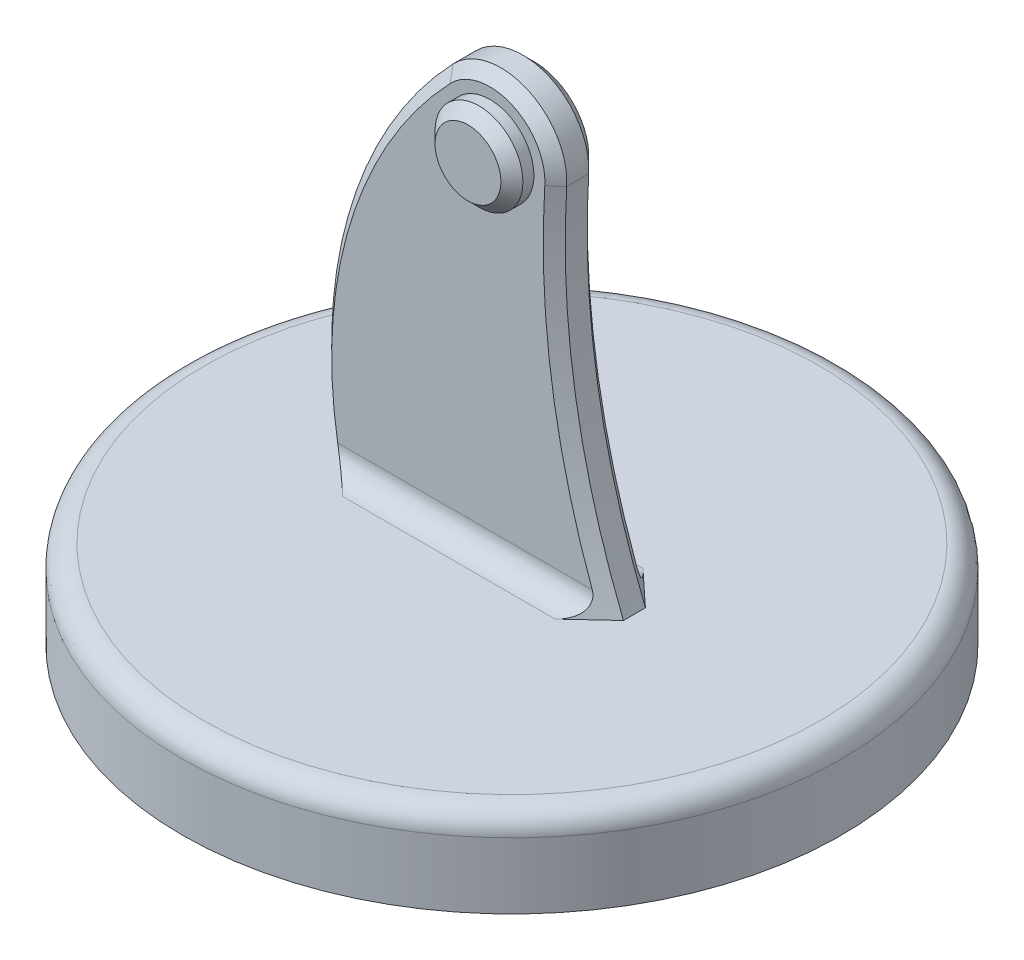
ISO-10303-21;
HEADER;
FILE_DESCRIPTION(('STEP AP214'),'2;1');
FILE_NAME('part.step','',(''),(''),'','','');
FILE_SCHEMA(('AUTOMOTIVE_DESIGN { 1 0 10303 214 1 1 1 1 }'));
ENDSEC;
DATA;
#1=APPLICATION_CONTEXT('core data for automotive mechanical design processes');
#2=APPLICATION_PROTOCOL_DEFINITION('international standard','automotive_design',2000,#1);
#3=PRODUCT_CONTEXT('',#1,'mechanical');
#4=PRODUCT('Part','Part','',(#3));
#5=PRODUCT_RELATED_PRODUCT_CATEGORY('part','',(#4));
#6=PRODUCT_DEFINITION_FORMATION('','',#4);
#7=PRODUCT_DEFINITION_CONTEXT('part definition',#1,'design');
#8=PRODUCT_DEFINITION('design','',#6,#7);
#9=PRODUCT_DEFINITION_SHAPE('','',#8);
#10=(LENGTH_UNIT() NAMED_UNIT(*) SI_UNIT(.MILLI.,.METRE.));
#11=(NAMED_UNIT(*) PLANE_ANGLE_UNIT() SI_UNIT($,.RADIAN.));
#12=(NAMED_UNIT(*) SI_UNIT($,.STERADIAN.) SOLID_ANGLE_UNIT());
#13=UNCERTAINTY_MEASURE_WITH_UNIT(LENGTH_MEASURE(1.E-05),#10,'distance_accuracy_value','');
#14=(GEOMETRIC_REPRESENTATION_CONTEXT(3) GLOBAL_UNCERTAINTY_ASSIGNED_CONTEXT((#13)) GLOBAL_UNIT_ASSIGNED_CONTEXT((#10,
#11,#12)) REPRESENTATION_CONTEXT('',''));
#15=CARTESIAN_POINT('',(0.,0.,0.));
#16=DIRECTION('',(0.,0.,1.));
#17=DIRECTION('',(1.,0.,0.));
#18=AXIS2_PLACEMENT_3D('',#15,#16,#17);
#19=CARTESIAN_POINT('',(0.,20.,0.));
#20=DIRECTION('',(0.,1.,0.));
#21=DIRECTION('',(0.,0.,1.));
#22=AXIS2_PLACEMENT_3D('',#19,#20,#21);
#23=PLANE('',#22);
#24=CARTESIAN_POINT('',(0.,20.,0.));
#25=DIRECTION('',(0.,1.,0.));
#26=DIRECTION('',(0.,0.,1.));
#27=AXIS2_PLACEMENT_3D('',#24,#25,#26);
#28=CIRCLE('',#27,70.);
#29=CARTESIAN_POINT('',(0.,20.,70.));
#30=VERTEX_POINT('',#29);
#31=EDGE_CURVE('E311',#30,#30,#28,.T.);
#32=ORIENTED_EDGE('',*,*,#31,.T.);
#33=EDGE_LOOP('',(#32));
#34=FACE_BOUND('',#33,.T.);
#35=CARTESIAN_POINT('',(-36.2257918410724,20.,-2.50000000000002));
#36=CARTESIAN_POINT('',(-35.372613344394,20.,-3.33359235450623));
#37=CARTESIAN_POINT('',(-34.5191891841924,20.,-4.16693335697092));
#38=CARTESIAN_POINT('',(-32.810937278002,20.,-5.83391380233446));
#39=CARTESIAN_POINT('',(-31.9561089872259,20.,-6.66755268694827));
#40=CARTESIAN_POINT('',(-30.2458713230933,20.,-8.3342347389184));
#41=CARTESIAN_POINT('',(-29.3904619495461,20.,-9.16727790607913));
#42=CARTESIAN_POINT('',(-28.5347400447996,20.,-9.99999999999031));
#43=B_SPLINE_CURVE_WITH_KNOTS('',3,(#35,#36,#37,#38,#39,#40,#41,#42),.UNSPECIFIED.,.F.,.F.,(4,2,
2,4),(0.,3.57842257820069,7.1604841137538,10.7425468249048),.UNSPECIFIED.);
#44=CARTESIAN_POINT('',(-36.2257918410724,20.,-2.50000000000002));
#45=VERTEX_POINT('',#44);
#46=CARTESIAN_POINT('',(-28.5347400447996,20.,-10.));
#47=VERTEX_POINT('',#46);
#48=EDGE_CURVE('E166',#45,#47,#43,.T.);
#49=ORIENTED_EDGE('',*,*,#48,.T.);
#50=DIRECTION('',(-1.,0.,0.));
#51=VECTOR('',#50,1.);
#52=CARTESIAN_POINT('',(25.1824752050036,20.,-10.));
#53=LINE('',#52,#51);
#54=CARTESIAN_POINT('',(19.8084097202043,20.,-10.));
#55=VERTEX_POINT('',#54);
#56=EDGE_CURVE('E271',#47,#55,#53,.F.);
#57=ORIENTED_EDGE('',*,*,#56,.T.);
#58=CARTESIAN_POINT('',(19.8084097202043,20.,-10.0000000000142));
#59=CARTESIAN_POINT('',(20.7032286114567,20.,-9.16574365324218));
#60=CARTESIAN_POINT('',(21.5984643871095,20.,-8.33193432975183));
#61=CARTESIAN_POINT('',(23.3898068938393,20.,-6.66525336177311));
#62=CARTESIAN_POINT('',(24.2859136241568,20.,-5.83238171646846));
#63=CARTESIAN_POINT('',(26.0805990637617,20.,-4.16616784041951));
#64=CARTESIAN_POINT('',(26.979179359604,20.,-3.33282731858596));
#65=CARTESIAN_POINT('',(27.8782351753599,20.,-2.50000000000002));
#66=B_SPLINE_CURVE_WITH_KNOTS('',3,(#58,#59,#60,#61,#62,#63,#64,#65),.UNSPECIFIED.,.F.,.F.,(4,2,
2,4),(0.,3.67017170975709,7.34034022203765,11.0169040821896),.UNSPECIFIED.);
#67=CARTESIAN_POINT('',(27.8782351753599,20.,-2.50000000000002));
#68=VERTEX_POINT('',#67);
#69=EDGE_CURVE('E174',#55,#68,#66,.T.);
#70=ORIENTED_EDGE('',*,*,#69,.T.);
#71=DIRECTION('',(0.,0.,-1.));
#72=VECTOR('',#71,1.);
#73=CARTESIAN_POINT('',(27.8782351753599,20.,5.));
#74=LINE('',#73,#72);
#75=CARTESIAN_POINT('',(27.8782351753599,20.,2.50000000000002));
#76=VERTEX_POINT('',#75);
#77=EDGE_CURVE('E134',#68,#76,#74,.F.);
#78=ORIENTED_EDGE('',*,*,#77,.T.);
#79=CARTESIAN_POINT('',(27.8782351753599,20.,2.50000000000002));
#80=CARTESIAN_POINT('',(26.979179359604,20.,3.33282731858595));
#81=CARTESIAN_POINT('',(26.0805990637617,20.,4.1661678404195));
#82=CARTESIAN_POINT('',(24.2859136241593,20.,5.8323817164661));
#83=CARTESIAN_POINT('',(23.3898068938444,20.,6.66525336176839));
#84=CARTESIAN_POINT('',(21.5984643871197,20.,8.33193432974237));
#85=CARTESIAN_POINT('',(20.7032286114694,20.,9.16574365323034));
#86=CARTESIAN_POINT('',(19.8084097202195,20.,9.99999999999999));
#87=B_SPLINE_CURVE_WITH_KNOTS('',3,(#79,#80,#81,#82,#83,#84,#85,#86),.UNSPECIFIED.,.F.,.F.,(4,2,
2,4),(0.,3.67656386015198,7.34673237242213,11.0169040821688),.UNSPECIFIED.);
#88=CARTESIAN_POINT('',(19.8084097202195,20.,10.));
#89=VERTEX_POINT('',#88);
#90=EDGE_CURVE('E124',#76,#89,#87,.T.);
#91=ORIENTED_EDGE('',*,*,#90,.T.);
#92=DIRECTION('',(-1.,0.,0.));
#93=VECTOR('',#92,1.);
#94=CARTESIAN_POINT('',(0.,20.,10.));
#95=LINE('',#94,#93);
#96=CARTESIAN_POINT('',(-28.5347400447897,20.,10.));
#97=VERTEX_POINT('',#96);
#98=EDGE_CURVE('E121',#89,#97,#95,.T.);
#99=ORIENTED_EDGE('',*,*,#98,.T.);
#100=CARTESIAN_POINT('',(-28.5347400447897,20.,10.));
#101=CARTESIAN_POINT('',(-29.3904619495378,20.,9.16727790608721));
#102=CARTESIAN_POINT('',(-30.2458713230867,20.,8.33423473892487));
#103=CARTESIAN_POINT('',(-31.9561089872226,20.,6.66755268695151));
#104=CARTESIAN_POINT('',(-32.8109372780003,20.,5.83391380233608));
#105=CARTESIAN_POINT('',(-34.5191891841924,20.,4.16693335697092));
#106=CARTESIAN_POINT('',(-35.372613344394,20.,3.33359235450623));
#107=CARTESIAN_POINT('',(-36.2257918410724,20.,2.50000000000002));
#108=B_SPLINE_CURVE_WITH_KNOTS('',3,(#100,#101,#102,#103,#104,#105,#106,#107),.UNSPECIFIED.,.F.,
.F.,(4,2,2,4),(0.,3.58206271115799,7.16412424671804,10.7425468249187),.UNSPECIFIED.);
#109=CARTESIAN_POINT('',(-36.2257918410724,20.,2.50000000000002));
#110=VERTEX_POINT('',#109);
#111=EDGE_CURVE('E117',#97,#110,#108,.T.);
#112=ORIENTED_EDGE('',*,*,#111,.T.);
#113=DIRECTION('',(0.,0.,-1.));
#114=VECTOR('',#113,1.);
#115=CARTESIAN_POINT('',(-36.2257918410724,20.,5.));
#116=LINE('',#115,#114);
#117=EDGE_CURVE('E119',#110,#45,#116,.T.);
#118=ORIENTED_EDGE('',*,*,#117,.T.);
#119=EDGE_LOOP('',(#49,#57,#70,#78,#91,#99,#112,#118));
#120=FACE_BOUND('',#119,.T.);
#121=ADVANCED_FACE('F38',(#34,#120),#23,.T.);
#122=CARTESIAN_POINT('',(0.,20.,0.));
#123=DIRECTION('',(0.,-1.,0.));
#124=DIRECTION('',(0.,0.,-1.));
#125=AXIS2_PLACEMENT_3D('',#122,#123,#124);
#126=CYLINDRICAL_SURFACE('',#125,75.);
#127=CARTESIAN_POINT('',(0.,15.,0.));
#128=DIRECTION('',(0.,1.,0.));
#129=DIRECTION('',(0.,0.,1.));
#130=AXIS2_PLACEMENT_3D('',#127,#128,#129);
#131=CIRCLE('',#130,75.);
#132=CARTESIAN_POINT('',(0.,15.,75.));
#133=VERTEX_POINT('',#132);
#134=EDGE_CURVE('E318',#133,#133,#131,.F.);
#135=ORIENTED_EDGE('',*,*,#134,.T.);
#136=EDGE_LOOP('',(#135));
#137=FACE_BOUND('',#136,.T.);
#138=CARTESIAN_POINT('',(0.,0.,0.));
#139=DIRECTION('',(0.,1.,0.));
#140=DIRECTION('',(0.,0.,1.));
#141=AXIS2_PLACEMENT_3D('',#138,#139,#140);
#142=CIRCLE('',#141,75.);
#143=CARTESIAN_POINT('',(0.,0.,75.));
#144=VERTEX_POINT('',#143);
#145=EDGE_CURVE('E308',#144,#144,#142,.T.);
#146=ORIENTED_EDGE('',*,*,#145,.T.);
#147=EDGE_LOOP('',(#146));
#148=FACE_BOUND('',#147,.T.);
#149=ADVANCED_FACE('F190',(#137,#148),#126,.T.);
#150=CARTESIAN_POINT('',(0.,0.,0.));
#151=DIRECTION('',(0.,1.,0.));
#152=DIRECTION('',(0.,0.,1.));
#153=AXIS2_PLACEMENT_3D('',#150,#151,#152);
#154=PLANE('',#153);
#155=ORIENTED_EDGE('',*,*,#145,.F.);
#156=EDGE_LOOP('',(#155));
#157=FACE_BOUND('',#156,.T.);
#158=ADVANCED_FACE('F193',(#157),#154,.F.);
#159=CARTESIAN_POINT('',(0.,15.,0.));
#160=DIRECTION('',(0.,1.,0.));
#161=DIRECTION('',(0.,0.,1.));
#162=AXIS2_PLACEMENT_3D('',#159,#160,#161);
#163=TOROIDAL_SURFACE('',#162,70.,5.);
#164=ORIENTED_EDGE('',*,*,#134,.F.);
#165=EDGE_LOOP('',(#164));
#166=FACE_BOUND('',#165,.T.);
#167=ORIENTED_EDGE('',*,*,#31,.F.);
#168=EDGE_LOOP('',(#167));
#169=FACE_BOUND('',#168,.T.);
#170=ADVANCED_FACE('F368',(#166,#169),#163,.T.);
#171=CARTESIAN_POINT('',(61.4788080980091,41.3028437243492,5.));
#172=DIRECTION('',(0.,0.,-1.));
#173=DIRECTION('',(-1.,0.,0.));
#174=AXIS2_PLACEMENT_3D('',#171,#172,#173);
#175=CYLINDRICAL_SURFACE('',#174,100.);
#176=DIRECTION('',(0.,0.,-1.));
#177=VECTOR('',#176,1.);
#178=CARTESIAN_POINT('',(-10.8492014290605,110.358321695703,5.));
#179=LINE('',#178,#177);
#180=CARTESIAN_POINT('',(-10.8492014290605,110.358321695703,2.50000000000002));
#181=VERTEX_POINT('',#180);
#182=CARTESIAN_POINT('',(-10.8492014290605,110.358321695703,-2.50000000000002));
#183=VERTEX_POINT('',#182);
#184=EDGE_CURVE('E286',#181,#183,#179,.T.);
#185=ORIENTED_EDGE('',*,*,#184,.T.);
#186=CARTESIAN_POINT('',(61.4788080980091,41.3028437243492,-2.50000000000002));
#187=DIRECTION('',(0.,0.,-1.));
#188=DIRECTION('',(-1.,0.,0.));
#189=AXIS2_PLACEMENT_3D('',#186,#187,#188);
#190=CIRCLE('',#189,100.);
#191=EDGE_CURVE('E133',#183,#45,#190,.F.);
#192=ORIENTED_EDGE('',*,*,#191,.T.);
#193=ORIENTED_EDGE('',*,*,#117,.F.);
#194=CARTESIAN_POINT('',(61.4788080980091,41.3028437243492,2.50000000000002));
#195=DIRECTION('',(0.,0.,-1.));
#196=DIRECTION('',(-1.,0.,0.));
#197=AXIS2_PLACEMENT_3D('',#194,#195,#196);
#198=CIRCLE('',#197,100.);
#199=EDGE_CURVE('E130',#110,#181,#198,.T.);
#200=ORIENTED_EDGE('',*,*,#199,.T.);
#201=EDGE_LOOP('',(#185,#192,#193,#200));
#202=FACE_BOUND('',#201,.T.);
#203=ADVANCED_FACE('F129',(#202),#175,.T.);
#204=CARTESIAN_POINT('',(194.618391581677,87.8064911464742,5.));
#205=DIRECTION('',(0.,0.,-1.));
#206=DIRECTION('',(-1.,0.,0.));
#207=AXIS2_PLACEMENT_3D('',#204,#205,#206);
#208=CYLINDRICAL_SURFACE('',#207,180.);
#209=ORIENTED_EDGE('',*,*,#77,.F.);
#210=CARTESIAN_POINT('',(194.618391581677,87.8064911464742,-2.50000000000002));
#211=DIRECTION('',(0.,0.,-1.));
#212=DIRECTION('',(-1.,0.,0.));
#213=AXIS2_PLACEMENT_3D('',#210,#211,#212);
#214=CIRCLE('',#213,180.);
#215=CARTESIAN_POINT('',(14.9706455062829,99.062037780498,-2.50000000000002));
#216=VERTEX_POINT('',#215);
#217=EDGE_CURVE('E154',#68,#216,#214,.T.);
#218=ORIENTED_EDGE('',*,*,#217,.T.);
#219=DIRECTION('',(0.,0.,-1.));
#220=VECTOR('',#219,1.);
#221=CARTESIAN_POINT('',(14.9706455062829,99.062037780498,5.));
#222=LINE('',#221,#220);
#223=CARTESIAN_POINT('',(14.9706455062829,99.062037780498,2.50000000000002));
#224=VERTEX_POINT('',#223);
#225=EDGE_CURVE('E303',#224,#216,#222,.T.);
#226=ORIENTED_EDGE('',*,*,#225,.F.);
#227=CARTESIAN_POINT('',(194.618391581677,87.8064911464742,2.50000000000002));
#228=DIRECTION('',(0.,0.,-1.));
#229=DIRECTION('',(-1.,0.,0.));
#230=AXIS2_PLACEMENT_3D('',#227,#228,#229);
#231=CIRCLE('',#230,180.);
#232=EDGE_CURVE('E152',#224,#76,#231,.F.);
#233=ORIENTED_EDGE('',*,*,#232,.T.);
#234=EDGE_LOOP('',(#209,#218,#226,#233));
#235=FACE_BOUND('',#234,.T.);
#236=ADVANCED_FACE('F302',(#235),#208,.F.);
#237=CARTESIAN_POINT('',(0.,100.,5.));
#238=DIRECTION('',(0.,0.,-1.));
#239=DIRECTION('',(-1.,0.,0.));
#240=AXIS2_PLACEMENT_3D('',#237,#238,#239);
#241=CYLINDRICAL_SURFACE('',#240,15.);
#242=ORIENTED_EDGE('',*,*,#225,.T.);
#243=CARTESIAN_POINT('',(0.,100.,-2.50000000000002));
#244=DIRECTION('',(0.,0.,-1.));
#245=DIRECTION('',(-1.,0.,0.));
#246=AXIS2_PLACEMENT_3D('',#243,#244,#245);
#247=CIRCLE('',#246,15.);
#248=EDGE_CURVE('E158',#216,#183,#247,.F.);
#249=ORIENTED_EDGE('',*,*,#248,.T.);
#250=ORIENTED_EDGE('',*,*,#184,.F.);
#251=CARTESIAN_POINT('',(0.,100.,2.50000000000002));
#252=DIRECTION('',(0.,0.,-1.));
#253=DIRECTION('',(-1.,0.,0.));
#254=AXIS2_PLACEMENT_3D('',#251,#252,#253);
#255=CIRCLE('',#254,15.);
#256=EDGE_CURVE('E156',#181,#224,#255,.T.);
#257=ORIENTED_EDGE('',*,*,#256,.T.);
#258=EDGE_LOOP('',(#242,#249,#250,#257));
#259=FACE_BOUND('',#258,.T.);
#260=ADVANCED_FACE('F307',(#259),#241,.T.);
#261=CARTESIAN_POINT('',(61.4788080980091,41.3028437243492,5.));
#262=DIRECTION('',(0.,0.,-1.));
#263=DIRECTION('',(-1.,0.,0.));
#264=AXIS2_PLACEMENT_3D('',#261,#262,#263);
#265=PLANE('',#264);
#266=CARTESIAN_POINT('',(0.,100.,5.));
#267=DIRECTION('',(0.,0.,-1.));
#268=DIRECTION('',(-1.,0.,0.));
#269=AXIS2_PLACEMENT_3D('',#266,#267,#268);
#270=CIRCLE('',#269,10.);
#271=CARTESIAN_POINT('',(-10.,100.,5.));
#272=VERTEX_POINT('',#271);
#273=EDGE_CURVE('E233',#272,#272,#270,.F.);
#274=ORIENTED_EDGE('',*,*,#273,.F.);
#275=EDGE_LOOP('',(#274));
#276=FACE_BOUND('',#275,.T.);
#277=CARTESIAN_POINT('',(61.4788080980091,41.3028437243492,5.));
#278=DIRECTION('',(0.,0.,-1.));
#279=DIRECTION('',(-1.,0.,0.));
#280=AXIS2_PLACEMENT_3D('',#277,#278,#279);
#281=CIRCLE('',#280,97.5);
#282=CARTESIAN_POINT('',(-9.04100119088372,108.631934746419,5.));
#283=VERTEX_POINT('',#282);
#284=CARTESIAN_POINT('',(-34.6485412178825,25.,5.));
#285=VERTEX_POINT('',#284);
#286=EDGE_CURVE('E162',#283,#285,#281,.F.);
#287=ORIENTED_EDGE('',*,*,#286,.T.);
#288=DIRECTION('',(-1.,0.,0.));
#289=VECTOR('',#288,1.);
#290=CARTESIAN_POINT('',(61.4788080980091,25.,5.));
#291=LINE('',#290,#289);
#292=CARTESIAN_POINT('',(23.2661384016624,25.,5.));
#293=VERTEX_POINT('',#292);
#294=EDGE_CURVE('E61',#285,#293,#291,.F.);
#295=ORIENTED_EDGE('',*,*,#294,.T.);
#296=CARTESIAN_POINT('',(194.618391581677,87.8064911464742,5.));
#297=DIRECTION('',(0.,0.,-1.));
#298=DIRECTION('',(-1.,0.,0.));
#299=AXIS2_PLACEMENT_3D('',#296,#297,#298);
#300=CIRCLE('',#299,182.5);
#301=CARTESIAN_POINT('',(12.4755379219024,99.2183648170816,5.));
#302=VERTEX_POINT('',#301);
#303=EDGE_CURVE('E164',#293,#302,#300,.T.);
#304=ORIENTED_EDGE('',*,*,#303,.T.);
#305=CARTESIAN_POINT('',(0.,100.,5.));
#306=DIRECTION('',(0.,0.,-1.));
#307=DIRECTION('',(-1.,0.,0.));
#308=AXIS2_PLACEMENT_3D('',#305,#306,#307);
#309=CIRCLE('',#308,12.5);
#310=EDGE_CURVE('E160',#302,#283,#309,.F.);
#311=ORIENTED_EDGE('',*,*,#310,.T.);
#312=EDGE_LOOP('',(#287,#295,#304,#311));
#313=FACE_BOUND('',#312,.T.);
#314=ADVANCED_FACE('F324',(#276,#313),#265,.F.);
#315=CARTESIAN_POINT('',(61.4788080980091,41.3028437243492,-5.));
#316=DIRECTION('',(0.,0.,-1.));
#317=DIRECTION('',(-1.,0.,0.));
#318=AXIS2_PLACEMENT_3D('',#315,#316,#317);
#319=PLANE('',#318);
#320=CARTESIAN_POINT('',(0.,100.,-5.));
#321=DIRECTION('',(0.,0.,-1.));
#322=DIRECTION('',(-1.,0.,0.));
#323=AXIS2_PLACEMENT_3D('',#320,#321,#322);
#324=CIRCLE('',#323,5.);
#325=CARTESIAN_POINT('',(-5.,100.,-5.));
#326=VERTEX_POINT('',#325);
#327=EDGE_CURVE('E513',#326,#326,#324,.T.);
#328=ORIENTED_EDGE('',*,*,#327,.F.);
#329=EDGE_LOOP('',(#328));
#330=FACE_BOUND('',#329,.T.);
#331=CARTESIAN_POINT('',(194.618391581677,87.8064911464742,-5.));
#332=DIRECTION('',(0.,0.,-1.));
#333=DIRECTION('',(-1.,0.,0.));
#334=AXIS2_PLACEMENT_3D('',#331,#332,#333);
#335=CIRCLE('',#334,182.5);
#336=CARTESIAN_POINT('',(12.4755379219024,99.2183648170816,-5.));
#337=VERTEX_POINT('',#336);
#338=CARTESIAN_POINT('',(23.2661384016624,25.,-5.));
#339=VERTEX_POINT('',#338);
#340=EDGE_CURVE('E147',#337,#339,#335,.F.);
#341=ORIENTED_EDGE('',*,*,#340,.T.);
#342=DIRECTION('',(-1.,0.,0.));
#343=VECTOR('',#342,1.);
#344=CARTESIAN_POINT('',(-33.6654972978261,25.,-5.));
#345=LINE('',#344,#343);
#346=CARTESIAN_POINT('',(-34.6485412178825,25.,-5.));
#347=VERTEX_POINT('',#346);
#348=EDGE_CURVE('E123',#339,#347,#345,.T.);
#349=ORIENTED_EDGE('',*,*,#348,.T.);
#350=CARTESIAN_POINT('',(61.4788080980091,41.3028437243492,-5.));
#351=DIRECTION('',(0.,0.,-1.));
#352=DIRECTION('',(-1.,0.,0.));
#353=AXIS2_PLACEMENT_3D('',#350,#351,#352);
#354=CIRCLE('',#353,97.5);
#355=CARTESIAN_POINT('',(-9.04100119088372,108.631934746419,-5.));
#356=VERTEX_POINT('',#355);
#357=EDGE_CURVE('E150',#347,#356,#354,.T.);
#358=ORIENTED_EDGE('',*,*,#357,.T.);
#359=CARTESIAN_POINT('',(0.,100.,-5.));
#360=DIRECTION('',(0.,0.,-1.));
#361=DIRECTION('',(-1.,0.,0.));
#362=AXIS2_PLACEMENT_3D('',#359,#360,#361);
#363=CIRCLE('',#362,12.5);
#364=EDGE_CURVE('E142',#356,#337,#363,.T.);
#365=ORIENTED_EDGE('',*,*,#364,.T.);
#366=EDGE_LOOP('',(#341,#349,#358,#365));
#367=FACE_BOUND('',#366,.T.);
#368=ADVANCED_FACE('F295',(#330,#367),#319,.T.);
#369=CARTESIAN_POINT('',(194.618391581677,87.8064911464742,-2.50000000000002));
#370=DIRECTION('',(0.,0.,-1.));
#371=DIRECTION('',(-1.,0.,0.));
#372=AXIS2_PLACEMENT_3D('',#369,#370,#371);
#373=CONICAL_SURFACE('',#372,180.,0.785398163397452);
#374=ORIENTED_EDGE('',*,*,#69,.F.);
#375=CARTESIAN_POINT('',(19.8084097202043,20.,-10.));
#376=CARTESIAN_POINT('',(19.9616222001253,20.0000298804786,-9.8571470411396));
#377=CARTESIAN_POINT('',(20.1137924014184,20.0061250464783,-9.71309524721116));
#378=CARTESIAN_POINT('',(20.415409925849,20.0312732005127,-9.42286389259848));
#379=CARTESIAN_POINT('',(20.564853026598,20.0503447774567,-9.27668157427854));
#380=CARTESIAN_POINT('',(20.8615528966854,20.1025626520144,-8.98125926299732));
#381=CARTESIAN_POINT('',(21.0087676549876,20.1358611613064,-8.83200332023877));
#382=CARTESIAN_POINT('',(21.2980316141157,20.2175964036329,-8.53280806026885));
#383=CARTESIAN_POINT('',(21.4400838108848,20.2660241950144,-8.38286919812));
#384=CARTESIAN_POINT('',(21.7828151280911,20.4058352198874,-8.01276165534407));
#385=CARTESIAN_POINT('',(21.9797828513804,20.5067135935933,-7.79259954803188));
#386=CARTESIAN_POINT('',(22.3528762269422,20.7482032050758,-7.35729519113085));
#387=CARTESIAN_POINT('',(22.5290705137496,20.8886780845658,-7.14213841035111));
#388=CARTESIAN_POINT('',(22.8168193138925,21.1785477540678,-6.7689824570937));
#389=CARTESIAN_POINT('',(22.9340909878616,21.319317167821,-6.60875060096273));
#390=CARTESIAN_POINT('',(23.1447782575394,21.6294430522913,-6.30040897896193));
#391=CARTESIAN_POINT('',(23.2382153446272,21.7987735392621,-6.15228837499695));
#392=CARTESIAN_POINT('',(23.3804737185172,22.1320581970151,-5.89995104941747));
#393=CARTESIAN_POINT('',(23.4342962789301,22.2915049540217,-5.79262885058604));
#394=CARTESIAN_POINT('',(23.5179262343751,22.6263855761247,-5.59504489142994));
#395=CARTESIAN_POINT('',(23.5477623016986,22.8018000739647,-5.50476286124212));
#396=CARTESIAN_POINT('',(23.5813327898911,23.164809290367,-5.3447311272832));
#397=CARTESIAN_POINT('',(23.5849884501377,23.3524390500978,-5.2750439831122));
#398=CARTESIAN_POINT('',(23.5658130806131,23.7337098754987,-5.15889768650676));
#399=CARTESIAN_POINT('',(23.5429456120547,23.9273588546061,-5.11247061551801));
#400=CARTESIAN_POINT('',(23.4808763212392,24.2692712797672,-5.05137708232143));
#401=CARTESIAN_POINT('',(23.4467017445601,24.4176298806911,-5.03183845273486));
#402=CARTESIAN_POINT('',(23.3858266399039,24.6380272597175,-5.01257591131664));
#403=CARTESIAN_POINT('',(23.3639728403144,24.7110279587214,-5.00782892798895));
#404=CARTESIAN_POINT('',(23.3172604092302,24.8561887780621,-5.00154052901008));
#405=CARTESIAN_POINT('',(23.2924023157316,24.9283490463696,-4.99999854031963));
#406=CARTESIAN_POINT('',(23.2661384016624,25.,-4.99999999999999));
#407=B_SPLINE_CURVE_WITH_KNOTS('',3,(#375,#376,#377,#378,#379,#380,#381,#382,#383,#384,#385,
#386,#387,#388,#389,#390,#391,#392,#393,#394,#395,#396,#397,#398,#399,#400,#401,#402,#403,#404,
#405,#406),.UNSPECIFIED.,.F.,.F.,(4,2,2,2,2,2,2,2,2,2,2,2,2,2,2,4),(0.,0.628421039599247,
1.25774420264545,1.89397597557009,2.52983243422414,3.46357701051947,4.39414453598002,
5.12178326458304,5.84876355163587,6.44503340287226,7.04058943781974,7.63793638210702,
8.2361049642349,8.69534624701893,8.92427835401959,9.15316952542021),.UNSPECIFIED.);
#408=EDGE_CURVE('E259',#55,#339,#407,.T.);
#409=ORIENTED_EDGE('',*,*,#408,.T.);
#410=ORIENTED_EDGE('',*,*,#340,.F.);
#411=DIRECTION('',(-0.70572299708217,0.0442159630604428,-0.707106781186546));
#412=VECTOR('',#411,1.);
#413=CARTESIAN_POINT('',(14.9706455062829,99.062037780498,-2.50000000000002));
#414=LINE('',#413,#412);
#415=EDGE_CURVE('E284',#216,#337,#414,.T.);
#416=ORIENTED_EDGE('',*,*,#415,.F.);
#417=ORIENTED_EDGE('',*,*,#217,.F.);
#418=EDGE_LOOP('',(#374,#409,#410,#416,#417));
#419=FACE_BOUND('',#418,.T.);
#420=ADVANCED_FACE('F221',(#419),#373,.F.);
#421=CARTESIAN_POINT('',(0.,100.,-2.50000000000002));
#422=DIRECTION('',(0.,0.,1.));
#423=DIRECTION('',(1.,0.,0.));
#424=AXIS2_PLACEMENT_3D('',#421,#422,#423);
#425=CONICAL_SURFACE('',#424,15.,0.785398163397451);
#426=ORIENTED_EDGE('',*,*,#415,.T.);
#427=ORIENTED_EDGE('',*,*,#364,.F.);
#428=DIRECTION('',(0.511436260063163,-0.488295967516226,-0.707106781186546));
#429=VECTOR('',#428,1.);
#430=CARTESIAN_POINT('',(-10.8492014290605,110.358321695703,-2.50000000000002));
#431=LINE('',#430,#429);
#432=EDGE_CURVE('E279',#183,#356,#431,.T.);
#433=ORIENTED_EDGE('',*,*,#432,.F.);
#434=ORIENTED_EDGE('',*,*,#248,.F.);
#435=EDGE_LOOP('',(#426,#427,#433,#434));
#436=FACE_BOUND('',#435,.T.);
#437=ADVANCED_FACE('F292',(#436),#425,.T.);
#438=CARTESIAN_POINT('',(61.4788080980091,41.3028437243492,-2.50000000000002));
#439=DIRECTION('',(0.,0.,1.));
#440=DIRECTION('',(1.,0.,0.));
#441=AXIS2_PLACEMENT_3D('',#438,#439,#440);
#442=CONICAL_SURFACE('',#441,100.,0.785398163397452);
#443=ORIENTED_EDGE('',*,*,#432,.T.);
#444=ORIENTED_EDGE('',*,*,#357,.F.);
#445=CARTESIAN_POINT('',(-34.6485412178825,25.,-5.));
#446=CARTESIAN_POINT('',(-34.6278263931646,24.8776737195309,-4.99997205696548));
#447=CARTESIAN_POINT('',(-34.6024065399032,24.7562262915276,-5.00448739117206));
#448=CARTESIAN_POINT('',(-34.5429849208855,24.5162780856462,-5.02201019394859));
#449=CARTESIAN_POINT('',(-34.508997529844,24.3977727337697,-5.03500349551893));
#450=CARTESIAN_POINT('',(-34.4336064530607,24.1657504184647,-5.06870753536354));
#451=CARTESIAN_POINT('',(-34.3922873438699,24.0521932495797,-5.08933290323475));
#452=CARTESIAN_POINT('',(-34.3028186663442,23.8293395597508,-5.13763804893629));
#453=CARTESIAN_POINT('',(-34.2546663483714,23.7200447766429,-5.16532067014758));
#454=CARTESIAN_POINT('',(-34.1018999874641,23.4007855163625,-5.25749953763443));
#455=CARTESIAN_POINT('',(-33.9883894250089,23.1977010164338,-5.33139897333394));
#456=CARTESIAN_POINT('',(-33.743108128065,22.8114075187661,-5.49947966844371));
#457=CARTESIAN_POINT('',(-33.6112792288648,22.6282652833932,-5.59372608368114));
#458=CARTESIAN_POINT('',(-33.3597715899798,22.3143795242672,-5.77930779563057));
#459=CARTESIAN_POINT('',(-33.2423430904442,22.1802045011359,-5.86796813176537));
#460=CARTESIAN_POINT('',(-33.0003701704359,21.9250062885372,-6.05419427532001));
#461=CARTESIAN_POINT('',(-32.875822262786,21.803989629899,-6.15176446112315));
#462=CARTESIAN_POINT('',(-32.620958183914,21.574515672378,-6.35451763345837));
#463=CARTESIAN_POINT('',(-32.4906317175558,21.4660821453441,-6.45971443821714));
#464=CARTESIAN_POINT('',(-32.2256565914918,21.261571364397,-6.67639624695991));
#465=CARTESIAN_POINT('',(-32.0910081512861,21.1654934842151,-6.78788093181871));
#466=CARTESIAN_POINT('',(-31.767082979519,20.9513521781691,-7.0591623462626));
#467=CARTESIAN_POINT('',(-31.5762977372455,20.8386006241572,-7.2213664455183));
#468=CARTESIAN_POINT('',(-31.19037990133,20.6347373401019,-7.55407285197027));
#469=CARTESIAN_POINT('',(-30.9952453847091,20.543635398434,-7.72457887087088));
#470=CARTESIAN_POINT('',(-30.6024455629516,20.3825905264103,-8.0722527946392));
#471=CARTESIAN_POINT('',(-30.4047817757244,20.312635473578,-8.2494168170551));
#472=CARTESIAN_POINT('',(-30.0083154260172,20.1935947017099,-8.6091926419597));
#473=CARTESIAN_POINT('',(-29.8095134145847,20.144499628215,-8.79180196315536));
#474=CARTESIAN_POINT('',(-29.4304409321059,20.0707858186542,-9.14430295407237));
#475=CARTESIAN_POINT('',(-29.2501629713124,20.0443183217429,-9.31380200505616));
#476=CARTESIAN_POINT('',(-28.891175594643,20.0089730286601,-9.65518491269283));
#477=CARTESIAN_POINT('',(-28.7124631020955,20.0000429318062,-9.82706013433483));
#478=CARTESIAN_POINT('',(-28.5347400447949,20.,-9.99999999999492));
#479=B_SPLINE_CURVE_WITH_KNOTS('',3,(#445,#446,#447,#448,#449,#450,#451,#452,#453,#454,#455,
#456,#457,#458,#459,#460,#461,#462,#463,#464,#465,#466,#467,#468,#469,#470,#471,#472,#473,#474,
#475,#476,#477,#478),.UNSPECIFIED.,.F.,.F.,(4,2,2,2,2,2,2,2,2,2,2,2,2,2,2,2,4),(0.,
0.371910340457603,0.743200791013907,1.11045779196236,1.47786299596238,2.20715942536886,
2.93882682183087,3.53541228861898,4.13229251712417,4.73028261116159,5.32824238300982,
6.15097947183995,6.97408783764378,7.79672345698737,8.6189897828711,9.36494146338211,
10.1086651405441),.UNSPECIFIED.);
#480=EDGE_CURVE('E253',#347,#47,#479,.T.);
#481=ORIENTED_EDGE('',*,*,#480,.T.);
#482=ORIENTED_EDGE('',*,*,#48,.F.);
#483=ORIENTED_EDGE('',*,*,#191,.F.);
#484=EDGE_LOOP('',(#443,#444,#481,#482,#483));
#485=FACE_BOUND('',#484,.T.);
#486=ADVANCED_FACE('F182',(#485),#442,.T.);
#487=CARTESIAN_POINT('',(61.4788080980091,41.3028437243492,5.));
#488=DIRECTION('',(0.,0.,-1.));
#489=DIRECTION('',(-1.,0.,0.));
#490=AXIS2_PLACEMENT_3D('',#487,#488,#489);
#491=CONICAL_SURFACE('',#490,97.5,0.785398163397453);
#492=ORIENTED_EDGE('',*,*,#111,.F.);
#493=CARTESIAN_POINT('',(-28.5347400447897,20.,10.));
#494=CARTESIAN_POINT('',(-28.6394037298974,20.000005434771,9.89815059591554));
#495=CARTESIAN_POINT('',(-28.7444044701096,20.0031117141702,9.79667872726324));
#496=CARTESIAN_POINT('',(-28.9548959740975,20.015430758412,9.59462953884507));
#497=CARTESIAN_POINT('',(-29.0603867081499,20.0246431575365,9.49405216587013));
#498=CARTESIAN_POINT('',(-29.3774210581305,20.0613070700193,9.19377282554194));
#499=CARTESIAN_POINT('',(-29.5894429565536,20.0977851443199,8.99560518423251));
#500=CARTESIAN_POINT('',(-30.0149470348641,20.1948303369437,8.60300164617535));
#501=CARTESIAN_POINT('',(-30.2284255574994,20.2556075268316,8.40861421626865));
#502=CARTESIAN_POINT('',(-30.6533009098754,20.4012836398836,8.02679361368093));
#503=CARTESIAN_POINT('',(-30.8646984190369,20.486174400497,7.83935811197358));
#504=CARTESIAN_POINT('',(-31.23581805139,20.6583962515183,7.51482560986986));
#505=CARTESIAN_POINT('',(-31.3963375276233,20.7407622681903,7.37599142315452));
#506=CARTESIAN_POINT('',(-31.7140120771384,20.920552010497,7.10437811445689));
#507=CARTESIAN_POINT('',(-31.8711678474207,21.0179725815724,6.97159773148073));
#508=CARTESIAN_POINT('',(-32.1804856522051,21.2281280967814,6.71357483416336));
#509=CARTESIAN_POINT('',(-32.3326604747659,21.340819251485,6.58831219251084));
#510=CARTESIAN_POINT('',(-32.6308687242772,21.5823060586908,6.34643164579908));
#511=CARTESIAN_POINT('',(-32.7769045910205,21.7110952309636,6.22981029212434));
#512=CARTESIAN_POINT('',(-33.1114401131507,22.0342782323159,5.96739519381317));
#513=CARTESIAN_POINT('',(-33.2966353855766,22.2357416578196,5.82592043060813));
#514=CARTESIAN_POINT('',(-33.6456704142065,22.6710303913349,5.5683239835165));
#515=CARTESIAN_POINT('',(-33.8095301722191,22.9048249589202,5.45217848375558));
#516=CARTESIAN_POINT('',(-34.0707148956104,23.3443131711605,5.27769119806797));
#517=CARTESIAN_POINT('',(-34.1745553911899,23.5431850809405,5.21216424392805));
#518=CARTESIAN_POINT('',(-34.3129103192239,23.8535368517304,5.13204069721148));
#519=CARTESIAN_POINT('',(-34.3560939901829,23.9588861391615,5.10837492195165));
#520=CARTESIAN_POINT('',(-34.4360284136756,24.1732140859586,5.06762637880011));
#521=CARTESIAN_POINT('',(-34.4727823057824,24.2821909429161,5.05054039316327));
#522=CARTESIAN_POINT('',(-34.535756379972,24.4918108462674,5.02489103654147));
#523=CARTESIAN_POINT('',(-34.5626708259066,24.5921598661021,5.01563242611837));
#524=CARTESIAN_POINT('',(-34.610349029853,24.7948018697914,5.00317605161259));
#525=CARTESIAN_POINT('',(-34.6311052843733,24.8970970648735,4.99998565599897));
#526=CARTESIAN_POINT('',(-34.6485412178825,25.,5.));
#527=B_SPLINE_CURVE_WITH_KNOTS('',3,(#493,#494,#495,#496,#497,#498,#499,#500,#501,#502,#503,
#504,#505,#506,#507,#508,#509,#510,#511,#512,#513,#514,#515,#516,#517,#518,#519,#520,#521,#522,
#523,#524,#525,#526),.UNSPECIFIED.,.F.,.F.,(4,2,2,2,2,2,2,2,2,2,2,2,2,2,2,2,4),(0.,
0.438046358396589,0.876066482945889,1.75245654359024,2.63659295844555,3.52043044513264,
4.2028449903657,4.88511673460736,5.56547186306227,6.24555399245991,7.16678571132558,
8.08714747013595,8.78553853656561,9.13405477041004,9.48240035064399,9.79495848648634,
10.107895911521),.UNSPECIFIED.);
#528=EDGE_CURVE('E54',#97,#285,#527,.T.);
#529=ORIENTED_EDGE('',*,*,#528,.T.);
#530=ORIENTED_EDGE('',*,*,#286,.F.);
#531=DIRECTION('',(0.511436260063163,-0.488295967516227,0.707106781186545));
#532=VECTOR('',#531,1.);
#533=CARTESIAN_POINT('',(-10.8492014290604,110.358321695703,2.50000000000002));
#534=LINE('',#533,#532);
#535=EDGE_CURVE('E139',#181,#283,#534,.T.);
#536=ORIENTED_EDGE('',*,*,#535,.F.);
#537=ORIENTED_EDGE('',*,*,#199,.F.);
#538=EDGE_LOOP('',(#492,#529,#530,#536,#537));
#539=FACE_BOUND('',#538,.T.);
#540=ADVANCED_FACE('F137',(#539),#491,.T.);
#541=CARTESIAN_POINT('',(0.,100.,5.));
#542=DIRECTION('',(0.,0.,-1.));
#543=DIRECTION('',(-1.,0.,0.));
#544=AXIS2_PLACEMENT_3D('',#541,#542,#543);
#545=CONICAL_SURFACE('',#544,12.5,0.785398163397452);
#546=ORIENTED_EDGE('',*,*,#535,.T.);
#547=ORIENTED_EDGE('',*,*,#310,.F.);
#548=DIRECTION('',(-0.705722997082171,0.0442159630604428,0.707106781186545));
#549=VECTOR('',#548,1.);
#550=CARTESIAN_POINT('',(14.9706455062829,99.062037780498,2.50000000000002));
#551=LINE('',#550,#549);
#552=EDGE_CURVE('E280',#224,#302,#551,.T.);
#553=ORIENTED_EDGE('',*,*,#552,.F.);
#554=ORIENTED_EDGE('',*,*,#256,.F.);
#555=EDGE_LOOP('',(#546,#547,#553,#554));
#556=FACE_BOUND('',#555,.T.);
#557=ADVANCED_FACE('F218',(#556),#545,.T.);
#558=CARTESIAN_POINT('',(194.618391581677,87.8064911464742,5.));
#559=DIRECTION('',(0.,0.,1.));
#560=DIRECTION('',(1.,0.,0.));
#561=AXIS2_PLACEMENT_3D('',#558,#559,#560);
#562=CONICAL_SURFACE('',#561,182.5,0.785398163397453);
#563=ORIENTED_EDGE('',*,*,#90,.F.);
#564=ORIENTED_EDGE('',*,*,#232,.F.);
#565=ORIENTED_EDGE('',*,*,#552,.T.);
#566=ORIENTED_EDGE('',*,*,#303,.F.);
#567=CARTESIAN_POINT('',(23.2661384016624,25.,5.));
#568=CARTESIAN_POINT('',(23.3002005671833,24.9070970588888,4.99998982101167));
#569=CARTESIAN_POINT('',(23.3319003658589,24.8132947634358,5.00258916549921));
#570=CARTESIAN_POINT('',(23.3901604515583,24.624343126443,5.01323591479231));
#571=CARTESIAN_POINT('',(23.4167170425788,24.5291928685387,5.02128721893147));
#572=CARTESIAN_POINT('',(23.4642590261445,24.3379983044757,5.04308274610182));
#573=CARTESIAN_POINT('',(23.4852365999853,24.2419529368185,5.05683489026829));
#574=CARTESIAN_POINT('',(23.5211837982653,24.0497650147842,5.09015681555101));
#575=CARTESIAN_POINT('',(23.536154895162,23.9536224900254,5.10972516880294));
#576=CARTESIAN_POINT('',(23.559843473077,23.7615087850931,5.15480488443815));
#577=CARTESIAN_POINT('',(23.5685335526406,23.6655401561134,5.18034165170114));
#578=CARTESIAN_POINT('',(23.579358971121,23.4749236099918,5.23722376580067));
#579=CARTESIAN_POINT('',(23.581491975839,23.3802761751035,5.26857117691084));
#580=CARTESIAN_POINT('',(23.5791344482646,23.1932936963799,5.33677201100208));
#581=CARTESIAN_POINT('',(23.5746576512134,23.1009542616797,5.37361387353917));
#582=CARTESIAN_POINT('',(23.5591775223305,22.919061246429,5.45252524641229));
#583=CARTESIAN_POINT('',(23.5481717304809,22.8295087293356,5.49459672245526));
#584=CARTESIAN_POINT('',(23.5205328957291,22.6581681393704,5.58133674973435));
#585=CARTESIAN_POINT('',(23.5042028834638,22.5762147571267,5.62577615786903));
#586=CARTESIAN_POINT('',(23.4660960259121,22.4158463901558,5.71855815688245));
#587=CARTESIAN_POINT('',(23.444317399856,22.3374325721739,5.76690202034876));
#588=CARTESIAN_POINT('',(23.3712669897884,22.1079558946016,5.91717329223244));
#589=CARTESIAN_POINT('',(23.3122859316015,21.9626892734793,6.02432427062642));
#590=CARTESIAN_POINT('',(23.1519246056421,21.6389242665395,6.29030441266746));
#591=CARTESIAN_POINT('',(23.0429297160746,21.4679275550975,6.45361876347931));
#592=CARTESIAN_POINT('',(22.8002588719763,21.1580788280493,6.79181102146743));
#593=CARTESIAN_POINT('',(22.6665421365393,21.0192807927284,6.96670772427774));
#594=CARTESIAN_POINT('',(22.3197638247351,20.7186526437609,7.39885475877627));
#595=CARTESIAN_POINT('',(22.0972299147783,20.5723698914756,7.65932857124396));
#596=CARTESIAN_POINT('',(21.7458214725293,20.3928428518393,8.05194856088021));
#597=CARTESIAN_POINT('',(21.6254999159944,20.3395856596789,8.18339715955415));
#598=CARTESIAN_POINT('',(21.3800348286691,20.2454846645251,8.44627656448093));
#599=CARTESIAN_POINT('',(21.2548922835546,20.2046383390844,8.57770736891518));
#600=CARTESIAN_POINT('',(21.0216039690425,20.1402893934769,8.81843555286565));
#601=CARTESIAN_POINT('',(20.9140295433624,20.115042165326,8.92783397103433));
#602=CARTESIAN_POINT('',(20.6966536902157,20.0722321318853,9.14592246129715));
#603=CARTESIAN_POINT('',(20.5868522553935,20.0546693519809,9.2546125310501));
#604=CARTESIAN_POINT('',(20.3664141647907,20.0269838470988,9.47008454014683));
#605=CARTESIAN_POINT('',(20.2557937252114,20.0167960789621,9.57687485159776));
#606=CARTESIAN_POINT('',(20.0331107499653,20.0033093732439,9.78932326315867));
#607=CARTESIAN_POINT('',(19.9210486204086,20.0000085366556,9.89498166738486));
#608=CARTESIAN_POINT('',(19.8084097202195,20.,10.));
#609=B_SPLINE_CURVE_WITH_KNOTS('',3,(#567,#568,#569,#570,#571,#572,#573,#574,#575,#576,#577,
#578,#579,#580,#581,#582,#583,#584,#585,#586,#587,#588,#589,#590,#591,#592,#593,#594,#595,#596,
#597,#598,#599,#600,#601,#602,#603,#604,#605,#606,#607,#608),.UNSPECIFIED.,.F.,.F.,(4,2,2,2,2,2,
2,2,2,2,2,2,2,2,2,2,2,2,2,2,4),(0.,0.29683137779651,0.593875278954068,0.891333303938967,
1.18871836397785,1.48739308625392,1.78617411897319,2.08433515458882,2.38260860379719,
2.66622794573051,2.94994010430046,3.51747042312946,4.294300827897,5.07242430682296,
6.18341813208095,6.74108455291979,7.29863755488181,7.76491483358025,8.2311936526023,
8.69330833935968,9.15529558547916),.UNSPECIFIED.);
#610=EDGE_CURVE('E225',#293,#89,#609,.T.);
#611=ORIENTED_EDGE('',*,*,#610,.T.);
#612=EDGE_LOOP('',(#563,#564,#565,#566,#611));
#613=FACE_BOUND('',#612,.T.);
#614=ADVANCED_FACE('F210',(#613),#562,.F.);
#615=CARTESIAN_POINT('',(61.4788080980091,25.,-10.));
#616=DIRECTION('',(1.,0.,0.));
#617=DIRECTION('',(0.,0.,-1.));
#618=AXIS2_PLACEMENT_3D('',#615,#616,#617);
#619=CYLINDRICAL_SURFACE('',#618,5.);
#620=ORIENTED_EDGE('',*,*,#408,.F.);
#621=ORIENTED_EDGE('',*,*,#56,.F.);
#622=ORIENTED_EDGE('',*,*,#480,.F.);
#623=ORIENTED_EDGE('',*,*,#348,.F.);
#624=EDGE_LOOP('',(#620,#621,#622,#623));
#625=FACE_BOUND('',#624,.T.);
#626=ADVANCED_FACE('F217',(#625),#619,.F.);
#627=CARTESIAN_POINT('',(0.,25.,10.));
#628=DIRECTION('',(-1.,0.,0.));
#629=DIRECTION('',(0.,0.,1.));
#630=AXIS2_PLACEMENT_3D('',#627,#628,#629);
#631=CYLINDRICAL_SURFACE('',#630,5.);
#632=ORIENTED_EDGE('',*,*,#610,.F.);
#633=ORIENTED_EDGE('',*,*,#294,.F.);
#634=ORIENTED_EDGE('',*,*,#528,.F.);
#635=ORIENTED_EDGE('',*,*,#98,.F.);
#636=EDGE_LOOP('',(#632,#633,#634,#635));
#637=FACE_BOUND('',#636,.T.);
#638=ADVANCED_FACE('F239',(#637),#631,.F.);
#639=CARTESIAN_POINT('',(0.,100.,10.));
#640=DIRECTION('',(0.,0.,-1.));
#641=DIRECTION('',(-1.,0.,0.));
#642=AXIS2_PLACEMENT_3D('',#639,#640,#641);
#643=CYLINDRICAL_SURFACE('',#642,10.);
#644=CARTESIAN_POINT('',(0.,100.,7.49999999999989));
#645=DIRECTION('',(0.,0.,1.));
#646=DIRECTION('',(1.,0.,0.));
#647=AXIS2_PLACEMENT_3D('',#644,#645,#646);
#648=CIRCLE('',#647,10.);
#649=CARTESIAN_POINT('',(10.,100.,7.49999999999989));
#650=VERTEX_POINT('',#649);
#651=EDGE_CURVE('E11',#650,#650,#648,.F.);
#652=ORIENTED_EDGE('',*,*,#651,.T.);
#653=EDGE_LOOP('',(#652));
#654=FACE_BOUND('',#653,.T.);
#655=ORIENTED_EDGE('',*,*,#273,.T.);
#656=EDGE_LOOP('',(#655));
#657=FACE_BOUND('',#656,.T.);
#658=ADVANCED_FACE('F243',(#654,#657),#643,.T.);
#659=CARTESIAN_POINT('',(0.,100.,10.));
#660=DIRECTION('',(0.,0.,1.));
#661=DIRECTION('',(1.,0.,0.));
#662=AXIS2_PLACEMENT_3D('',#659,#660,#661);
#663=PLANE('',#662);
#664=CARTESIAN_POINT('',(0.,100.,10.));
#665=DIRECTION('',(0.,0.,1.));
#666=DIRECTION('',(1.,0.,0.));
#667=AXIS2_PLACEMENT_3D('',#664,#665,#666);
#668=CIRCLE('',#667,7.4999999999999);
#669=CARTESIAN_POINT('',(7.4999999999999,100.,10.));
#670=VERTEX_POINT('',#669);
#671=EDGE_CURVE('E47',#670,#670,#668,.T.);
#672=ORIENTED_EDGE('',*,*,#671,.T.);
#673=EDGE_LOOP('',(#672));
#674=FACE_BOUND('',#673,.T.);
#675=ADVANCED_FACE('F470',(#674),#663,.T.);
#676=CARTESIAN_POINT('',(0.,100.,10.));
#677=DIRECTION('',(0.,0.,-1.));
#678=DIRECTION('',(-1.,0.,0.));
#679=AXIS2_PLACEMENT_3D('',#676,#677,#678);
#680=CONICAL_SURFACE('',#679,7.4999999999999,0.785398163397447);
#681=ORIENTED_EDGE('',*,*,#651,.F.);
#682=EDGE_LOOP('',(#681));
#683=FACE_BOUND('',#682,.T.);
#684=ORIENTED_EDGE('',*,*,#671,.F.);
#685=EDGE_LOOP('',(#684));
#686=FACE_BOUND('',#685,.T.);
#687=ADVANCED_FACE('F41',(#683,#686),#680,.T.);
#688=CARTESIAN_POINT('',(0.,100.,5.));
#689=DIRECTION('',(0.,0.,-1.));
#690=DIRECTION('',(-1.,0.,0.));
#691=AXIS2_PLACEMENT_3D('',#688,#689,#690);
#692=CYLINDRICAL_SURFACE('',#691,5.);
#693=CARTESIAN_POINT('',(0.,100.,5.));
#694=DIRECTION('',(0.,0.,-1.));
#695=DIRECTION('',(-1.,0.,0.));
#696=AXIS2_PLACEMENT_3D('',#693,#694,#695);
#697=CIRCLE('',#696,5.);
#698=CARTESIAN_POINT('',(-5.,100.,5.));
#699=VERTEX_POINT('',#698);
#700=EDGE_CURVE('E283',#699,#699,#697,.T.);
#701=ORIENTED_EDGE('',*,*,#700,.F.);
#702=EDGE_LOOP('',(#701));
#703=FACE_BOUND('',#702,.T.);
#704=ORIENTED_EDGE('',*,*,#327,.T.);
#705=EDGE_LOOP('',(#704));
#706=FACE_BOUND('',#705,.T.);
#707=ADVANCED_FACE('F485',(#703,#706),#692,.F.);
#708=CARTESIAN_POINT('',(0.,100.,5.));
#709=DIRECTION('',(0.,0.,-1.));
#710=DIRECTION('',(-1.,0.,0.));
#711=AXIS2_PLACEMENT_3D('',#708,#709,#710);
#712=PLANE('',#711);
#713=ORIENTED_EDGE('',*,*,#700,.T.);
#714=EDGE_LOOP('',(#713));
#715=FACE_BOUND('',#714,.T.);
#716=ADVANCED_FACE('F492',(#715),#712,.T.);
#717=CLOSED_SHELL('',(#121,#149,#158,#170,#203,#236,#260,#314,#368,#420,#437,#486,#540,#557,
#614,#626,#638,#658,#675,#687,#707,#716));
#718=MANIFOLD_SOLID_BREP('B2',#717);
#719=ADVANCED_BREP_SHAPE_REPRESENTATION('',(#18,#718),#14);
#720=SHAPE_DEFINITION_REPRESENTATION(#9,#719);
ENDSEC;
END-ISO-10303-21;
